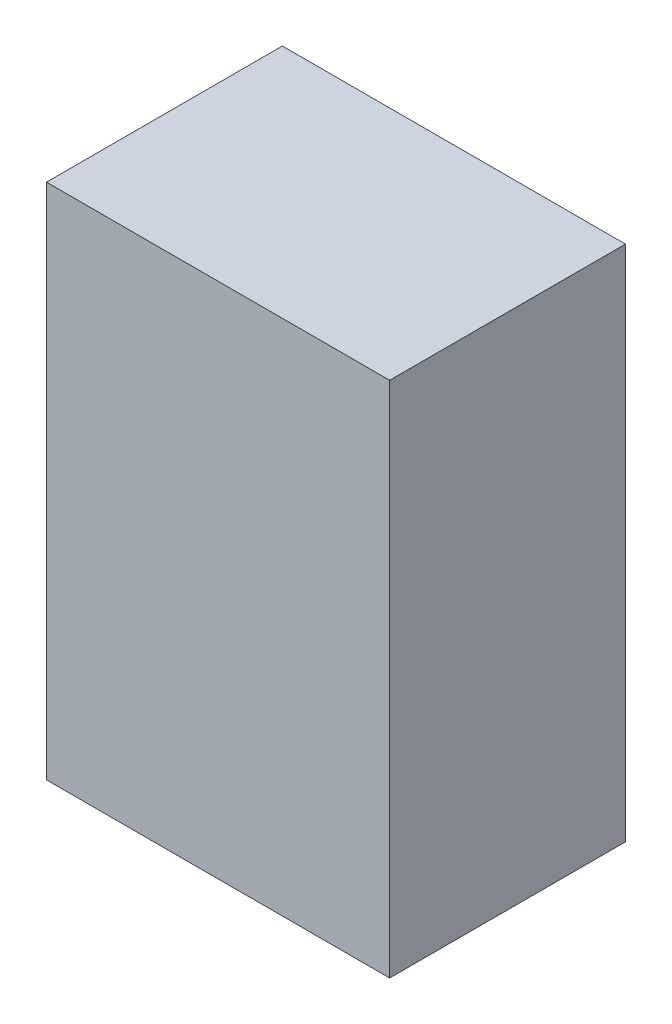
ISO-10303-21;
HEADER;
FILE_DESCRIPTION(('STEP AP214'),'2;1');
FILE_NAME('part.step','',(''),(''),'','','');
FILE_SCHEMA(('AUTOMOTIVE_DESIGN { 1 0 10303 214 1 1 1 1 }'));
ENDSEC;
DATA;
#1=APPLICATION_CONTEXT('core data for automotive mechanical design processes');
#2=APPLICATION_PROTOCOL_DEFINITION('international standard','automotive_design',2000,#1);
#3=PRODUCT_CONTEXT('',#1,'mechanical');
#4=PRODUCT('Part','Part','',(#3));
#5=PRODUCT_RELATED_PRODUCT_CATEGORY('part','',(#4));
#6=PRODUCT_DEFINITION_FORMATION('','',#4);
#7=PRODUCT_DEFINITION_CONTEXT('part definition',#1,'design');
#8=PRODUCT_DEFINITION('design','',#6,#7);
#9=PRODUCT_DEFINITION_SHAPE('','',#8);
#10=(LENGTH_UNIT() NAMED_UNIT(*) SI_UNIT(.MILLI.,.METRE.));
#11=(NAMED_UNIT(*) PLANE_ANGLE_UNIT() SI_UNIT($,.RADIAN.));
#12=(NAMED_UNIT(*) SI_UNIT($,.STERADIAN.) SOLID_ANGLE_UNIT());
#13=UNCERTAINTY_MEASURE_WITH_UNIT(LENGTH_MEASURE(1.E-05),#10,'distance_accuracy_value','');
#14=(GEOMETRIC_REPRESENTATION_CONTEXT(3) GLOBAL_UNCERTAINTY_ASSIGNED_CONTEXT((#13)) GLOBAL_UNIT_ASSIGNED_CONTEXT((#10,
#11,#12)) REPRESENTATION_CONTEXT('',''));
#15=CARTESIAN_POINT('',(0.,0.,0.));
#16=DIRECTION('',(0.,0.,1.));
#17=DIRECTION('',(1.,0.,0.));
#18=AXIS2_PLACEMENT_3D('',#15,#16,#17);
#19=CARTESIAN_POINT('',(29.1,-43.9,20.));
#20=DIRECTION('',(-1.,0.,0.));
#21=DIRECTION('',(0.,0.,1.));
#22=AXIS2_PLACEMENT_3D('',#19,#20,#21);
#23=PLANE('',#22);
#24=DIRECTION('',(0.,1.,0.));
#25=VECTOR('',#24,1.);
#26=CARTESIAN_POINT('',(29.1,-43.9,-20.));
#27=LINE('',#26,#25);
#28=CARTESIAN_POINT('',(29.1,-43.9,-20.));
#29=VERTEX_POINT('',#28);
#30=CARTESIAN_POINT('',(29.1,43.9,-20.));
#31=VERTEX_POINT('',#30);
#32=EDGE_CURVE('E102',#29,#31,#27,.T.);
#33=ORIENTED_EDGE('',*,*,#32,.T.);
#34=DIRECTION('',(0.,0.,-1.));
#35=VECTOR('',#34,1.);
#36=CARTESIAN_POINT('',(29.1,43.9,20.));
#37=LINE('',#36,#35);
#38=CARTESIAN_POINT('',(29.1,43.9,20.));
#39=VERTEX_POINT('',#38);
#40=EDGE_CURVE('E11',#39,#31,#37,.T.);
#41=ORIENTED_EDGE('',*,*,#40,.F.);
#42=DIRECTION('',(0.,1.,0.));
#43=VECTOR('',#42,1.);
#44=CARTESIAN_POINT('',(29.1,-43.9,20.));
#45=LINE('',#44,#43);
#46=CARTESIAN_POINT('',(29.1,-43.9,20.));
#47=VERTEX_POINT('',#46);
#48=EDGE_CURVE('E90',#47,#39,#45,.T.);
#49=ORIENTED_EDGE('',*,*,#48,.F.);
#50=DIRECTION('',(0.,0.,-1.));
#51=VECTOR('',#50,1.);
#52=CARTESIAN_POINT('',(29.1,-43.9,20.));
#53=LINE('',#52,#51);
#54=EDGE_CURVE('E98',#47,#29,#53,.T.);
#55=ORIENTED_EDGE('',*,*,#54,.T.);
#56=EDGE_LOOP('',(#33,#41,#49,#55));
#57=FACE_BOUND('',#56,.T.);
#58=ADVANCED_FACE('F39',(#57),#23,.F.);
#59=CARTESIAN_POINT('',(-29.1,43.9,20.));
#60=DIRECTION('',(0.,-1.,0.));
#61=DIRECTION('',(0.,0.,-1.));
#62=AXIS2_PLACEMENT_3D('',#59,#60,#61);
#63=PLANE('',#62);
#64=DIRECTION('',(-1.,0.,0.));
#65=VECTOR('',#64,1.);
#66=CARTESIAN_POINT('',(-29.1,43.9,-20.));
#67=LINE('',#66,#65);
#68=CARTESIAN_POINT('',(-29.1,43.9,-20.));
#69=VERTEX_POINT('',#68);
#70=EDGE_CURVE('E94',#31,#69,#67,.T.);
#71=ORIENTED_EDGE('',*,*,#70,.T.);
#72=DIRECTION('',(0.,0.,-1.));
#73=VECTOR('',#72,1.);
#74=CARTESIAN_POINT('',(-29.1,43.9,20.));
#75=LINE('',#74,#73);
#76=CARTESIAN_POINT('',(-29.1,43.9,20.));
#77=VERTEX_POINT('',#76);
#78=EDGE_CURVE('E47',#77,#69,#75,.T.);
#79=ORIENTED_EDGE('',*,*,#78,.F.);
#80=DIRECTION('',(-1.,0.,0.));
#81=VECTOR('',#80,1.);
#82=CARTESIAN_POINT('',(-29.1,43.9,20.));
#83=LINE('',#82,#81);
#84=EDGE_CURVE('E85',#39,#77,#83,.T.);
#85=ORIENTED_EDGE('',*,*,#84,.F.);
#86=ORIENTED_EDGE('',*,*,#40,.T.);
#87=EDGE_LOOP('',(#71,#79,#85,#86));
#88=FACE_BOUND('',#87,.T.);
#89=ADVANCED_FACE('F93',(#88),#63,.F.);
#90=CARTESIAN_POINT('',(-29.1,-43.9,20.));
#91=DIRECTION('',(1.,0.,0.));
#92=DIRECTION('',(0.,0.,-1.));
#93=AXIS2_PLACEMENT_3D('',#90,#91,#92);
#94=PLANE('',#93);
#95=DIRECTION('',(0.,-1.,0.));
#96=VECTOR('',#95,1.);
#97=CARTESIAN_POINT('',(-29.1,-43.9,-20.));
#98=LINE('',#97,#96);
#99=CARTESIAN_POINT('',(-29.1,-43.9,-20.));
#100=VERTEX_POINT('',#99);
#101=EDGE_CURVE('E72',#69,#100,#98,.T.);
#102=ORIENTED_EDGE('',*,*,#101,.T.);
#103=DIRECTION('',(0.,0.,-1.));
#104=VECTOR('',#103,1.);
#105=CARTESIAN_POINT('',(-29.1,-43.9,20.));
#106=LINE('',#105,#104);
#107=CARTESIAN_POINT('',(-29.1,-43.9,20.));
#108=VERTEX_POINT('',#107);
#109=EDGE_CURVE('E95',#108,#100,#106,.T.);
#110=ORIENTED_EDGE('',*,*,#109,.F.);
#111=DIRECTION('',(0.,-1.,0.));
#112=VECTOR('',#111,1.);
#113=CARTESIAN_POINT('',(-29.1,-43.9,20.));
#114=LINE('',#113,#112);
#115=EDGE_CURVE('E88',#77,#108,#114,.T.);
#116=ORIENTED_EDGE('',*,*,#115,.F.);
#117=ORIENTED_EDGE('',*,*,#78,.T.);
#118=EDGE_LOOP('',(#102,#110,#116,#117));
#119=FACE_BOUND('',#118,.T.);
#120=ADVANCED_FACE('F96',(#119),#94,.F.);
#121=CARTESIAN_POINT('',(-29.1,-43.9,20.));
#122=DIRECTION('',(0.,1.,0.));
#123=DIRECTION('',(0.,0.,1.));
#124=AXIS2_PLACEMENT_3D('',#121,#122,#123);
#125=PLANE('',#124);
#126=DIRECTION('',(1.,0.,0.));
#127=VECTOR('',#126,1.);
#128=CARTESIAN_POINT('',(-29.1,-43.9,-20.));
#129=LINE('',#128,#127);
#130=EDGE_CURVE('E78',#100,#29,#129,.T.);
#131=ORIENTED_EDGE('',*,*,#130,.T.);
#132=ORIENTED_EDGE('',*,*,#54,.F.);
#133=DIRECTION('',(1.,0.,0.));
#134=VECTOR('',#133,1.);
#135=CARTESIAN_POINT('',(-29.1,-43.9,20.));
#136=LINE('',#135,#134);
#137=EDGE_CURVE('E55',#108,#47,#136,.T.);
#138=ORIENTED_EDGE('',*,*,#137,.F.);
#139=ORIENTED_EDGE('',*,*,#109,.T.);
#140=EDGE_LOOP('',(#131,#132,#138,#139));
#141=FACE_BOUND('',#140,.T.);
#142=ADVANCED_FACE('F109',(#141),#125,.F.);
#143=CARTESIAN_POINT('',(0.,0.,20.));
#144=DIRECTION('',(0.,0.,-1.));
#145=DIRECTION('',(-1.,0.,0.));
#146=AXIS2_PLACEMENT_3D('',#143,#144,#145);
#147=PLANE('',#146);
#148=ORIENTED_EDGE('',*,*,#48,.T.);
#149=ORIENTED_EDGE('',*,*,#84,.T.);
#150=ORIENTED_EDGE('',*,*,#115,.T.);
#151=ORIENTED_EDGE('',*,*,#137,.T.);
#152=EDGE_LOOP('',(#148,#149,#150,#151));
#153=FACE_BOUND('',#152,.T.);
#154=ADVANCED_FACE('F86',(#153),#147,.F.);
#155=CARTESIAN_POINT('',(0.,0.,-20.));
#156=DIRECTION('',(0.,0.,-1.));
#157=DIRECTION('',(-1.,0.,0.));
#158=AXIS2_PLACEMENT_3D('',#155,#156,#157);
#159=PLANE('',#158);
#160=ORIENTED_EDGE('',*,*,#32,.F.);
#161=ORIENTED_EDGE('',*,*,#130,.F.);
#162=ORIENTED_EDGE('',*,*,#101,.F.);
#163=ORIENTED_EDGE('',*,*,#70,.F.);
#164=EDGE_LOOP('',(#160,#161,#162,#163));
#165=FACE_BOUND('',#164,.T.);
#166=ADVANCED_FACE('F112',(#165),#159,.T.);
#167=CLOSED_SHELL('',(#58,#89,#120,#142,#154,#166));
#168=MANIFOLD_SOLID_BREP('B2',#167);
#169=ADVANCED_BREP_SHAPE_REPRESENTATION('',(#18,#168),#14);
#170=SHAPE_DEFINITION_REPRESENTATION(#9,#169);
ENDSEC;
END-ISO-10303-21;
